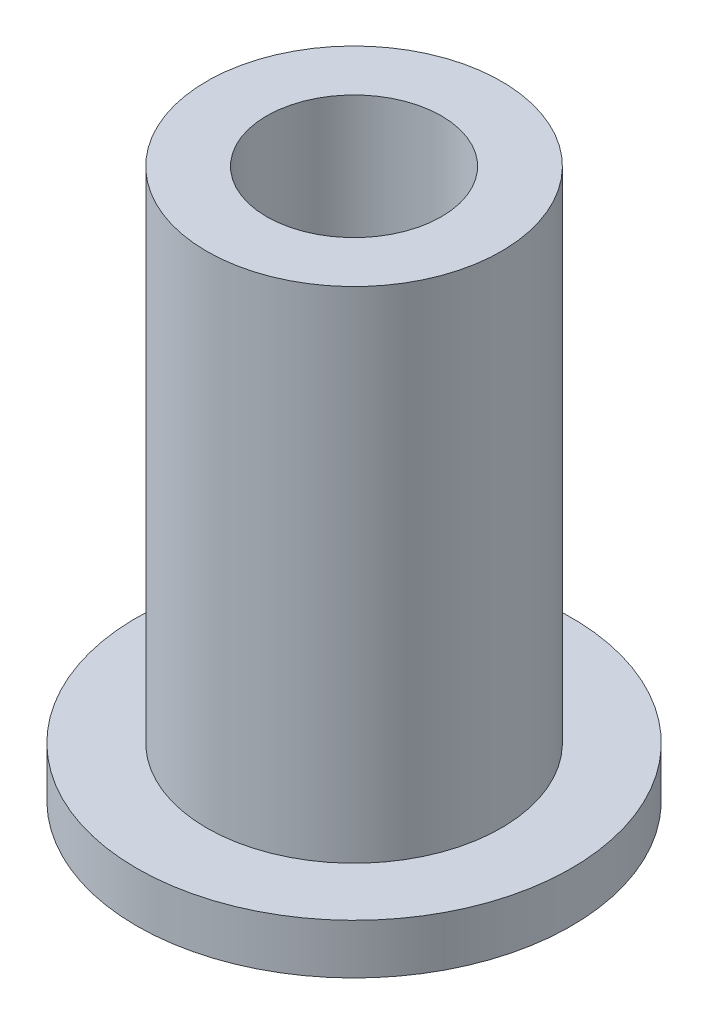
ISO-10303-21;
HEADER;
FILE_DESCRIPTION(('STEP AP214'),'2;1');
FILE_NAME('part.step','',(''),(''),'','','');
FILE_SCHEMA(('AUTOMOTIVE_DESIGN { 1 0 10303 214 1 1 1 1 }'));
ENDSEC;
DATA;
#1=APPLICATION_CONTEXT('core data for automotive mechanical design processes');
#2=APPLICATION_PROTOCOL_DEFINITION('international standard','automotive_design',2000,#1);
#3=PRODUCT_CONTEXT('',#1,'mechanical');
#4=PRODUCT('Part','Part','',(#3));
#5=PRODUCT_RELATED_PRODUCT_CATEGORY('part','',(#4));
#6=PRODUCT_DEFINITION_FORMATION('','',#4);
#7=PRODUCT_DEFINITION_CONTEXT('part definition',#1,'design');
#8=PRODUCT_DEFINITION('design','',#6,#7);
#9=PRODUCT_DEFINITION_SHAPE('','',#8);
#10=(LENGTH_UNIT() NAMED_UNIT(*) SI_UNIT(.MILLI.,.METRE.));
#11=(NAMED_UNIT(*) PLANE_ANGLE_UNIT() SI_UNIT($,.RADIAN.));
#12=(NAMED_UNIT(*) SI_UNIT($,.STERADIAN.) SOLID_ANGLE_UNIT());
#13=UNCERTAINTY_MEASURE_WITH_UNIT(LENGTH_MEASURE(1.E-05),#10,'distance_accuracy_value','');
#14=(GEOMETRIC_REPRESENTATION_CONTEXT(3) GLOBAL_UNCERTAINTY_ASSIGNED_CONTEXT((#13)) GLOBAL_UNIT_ASSIGNED_CONTEXT((#10,
#11,#12)) REPRESENTATION_CONTEXT('',''));
#15=CARTESIAN_POINT('',(0.,0.,0.));
#16=DIRECTION('',(0.,0.,1.));
#17=DIRECTION('',(1.,0.,0.));
#18=AXIS2_PLACEMENT_3D('',#15,#16,#17);
#19=CARTESIAN_POINT('',(0.,1.,0.));
#20=DIRECTION('',(0.,-1.,0.));
#21=DIRECTION('',(0.,0.,-1.));
#22=AXIS2_PLACEMENT_3D('',#19,#20,#21);
#23=CYLINDRICAL_SURFACE('',#22,4.35);
#24=CARTESIAN_POINT('',(0.,1.,0.));
#25=DIRECTION('',(0.,1.,0.));
#26=DIRECTION('',(0.,0.,1.));
#27=AXIS2_PLACEMENT_3D('',#24,#25,#26);
#28=CIRCLE('',#27,4.35);
#29=CARTESIAN_POINT('',(0.,1.,4.35));
#30=VERTEX_POINT('',#29);
#31=EDGE_CURVE('E38',#30,#30,#28,.T.);
#32=ORIENTED_EDGE('',*,*,#31,.F.);
#33=EDGE_LOOP('',(#32));
#34=FACE_BOUND('',#33,.T.);
#35=CARTESIAN_POINT('',(0.,0.,0.));
#36=DIRECTION('',(0.,1.,0.));
#37=DIRECTION('',(0.,0.,1.));
#38=AXIS2_PLACEMENT_3D('',#35,#36,#37);
#39=CIRCLE('',#38,4.35);
#40=CARTESIAN_POINT('',(0.,0.,4.35));
#41=VERTEX_POINT('',#40);
#42=EDGE_CURVE('E34',#41,#41,#39,.T.);
#43=ORIENTED_EDGE('',*,*,#42,.T.);
#44=EDGE_LOOP('',(#43));
#45=FACE_BOUND('',#44,.T.);
#46=ADVANCED_FACE('F31',(#34,#45),#23,.T.);
#47=CARTESIAN_POINT('',(0.,1.,0.));
#48=DIRECTION('',(0.,1.,0.));
#49=DIRECTION('',(0.,0.,1.));
#50=AXIS2_PLACEMENT_3D('',#47,#48,#49);
#51=PLANE('',#50);
#52=CARTESIAN_POINT('',(0.,1.,0.));
#53=DIRECTION('',(0.,1.,0.));
#54=DIRECTION('',(0.,0.,1.));
#55=AXIS2_PLACEMENT_3D('',#52,#53,#54);
#56=CIRCLE('',#55,2.95);
#57=CARTESIAN_POINT('',(0.,1.,2.95));
#58=VERTEX_POINT('',#57);
#59=EDGE_CURVE('E10',#58,#58,#56,.T.);
#60=ORIENTED_EDGE('',*,*,#59,.F.);
#61=EDGE_LOOP('',(#60));
#62=FACE_BOUND('',#61,.T.);
#63=ORIENTED_EDGE('',*,*,#31,.T.);
#64=EDGE_LOOP('',(#63));
#65=FACE_BOUND('',#64,.T.);
#66=ADVANCED_FACE('F75',(#62,#65),#51,.T.);
#67=CARTESIAN_POINT('',(0.,0.,0.));
#68=DIRECTION('',(0.,1.,0.));
#69=DIRECTION('',(0.,0.,1.));
#70=AXIS2_PLACEMENT_3D('',#67,#68,#69);
#71=PLANE('',#70);
#72=CARTESIAN_POINT('',(0.,0.,0.));
#73=DIRECTION('',(0.,1.,0.));
#74=DIRECTION('',(0.,0.,1.));
#75=AXIS2_PLACEMENT_3D('',#72,#73,#74);
#76=CIRCLE('',#75,1.75);
#77=CARTESIAN_POINT('',(0.,0.,1.75));
#78=VERTEX_POINT('',#77);
#79=EDGE_CURVE('E47',#78,#78,#76,.T.);
#80=ORIENTED_EDGE('',*,*,#79,.T.);
#81=EDGE_LOOP('',(#80));
#82=FACE_BOUND('',#81,.T.);
#83=ORIENTED_EDGE('',*,*,#42,.F.);
#84=EDGE_LOOP('',(#83));
#85=FACE_BOUND('',#84,.T.);
#86=ADVANCED_FACE('F54',(#82,#85),#71,.F.);
#87=CARTESIAN_POINT('',(0.,11.,0.));
#88=DIRECTION('',(0.,-1.,0.));
#89=DIRECTION('',(0.,0.,-1.));
#90=AXIS2_PLACEMENT_3D('',#87,#88,#89);
#91=CYLINDRICAL_SURFACE('',#90,2.95);
#92=CARTESIAN_POINT('',(0.,11.,0.));
#93=DIRECTION('',(0.,1.,0.));
#94=DIRECTION('',(0.,0.,1.));
#95=AXIS2_PLACEMENT_3D('',#92,#93,#94);
#96=CIRCLE('',#95,2.95);
#97=CARTESIAN_POINT('',(0.,11.,2.95));
#98=VERTEX_POINT('',#97);
#99=EDGE_CURVE('E44',#98,#98,#96,.T.);
#100=ORIENTED_EDGE('',*,*,#99,.F.);
#101=EDGE_LOOP('',(#100));
#102=FACE_BOUND('',#101,.T.);
#103=ORIENTED_EDGE('',*,*,#59,.T.);
#104=EDGE_LOOP('',(#103));
#105=FACE_BOUND('',#104,.T.);
#106=ADVANCED_FACE('F66',(#102,#105),#91,.T.);
#107=CARTESIAN_POINT('',(0.,11.,0.));
#108=DIRECTION('',(0.,1.,0.));
#109=DIRECTION('',(0.,0.,1.));
#110=AXIS2_PLACEMENT_3D('',#107,#108,#109);
#111=PLANE('',#110);
#112=CARTESIAN_POINT('',(0.,11.,0.));
#113=DIRECTION('',(0.,1.,0.));
#114=DIRECTION('',(0.,0.,1.));
#115=AXIS2_PLACEMENT_3D('',#112,#113,#114);
#116=CIRCLE('',#115,1.75);
#117=CARTESIAN_POINT('',(0.,11.,1.75));
#118=VERTEX_POINT('',#117);
#119=EDGE_CURVE('E48',#118,#118,#116,.T.);
#120=ORIENTED_EDGE('',*,*,#119,.F.);
#121=EDGE_LOOP('',(#120));
#122=FACE_BOUND('',#121,.T.);
#123=ORIENTED_EDGE('',*,*,#99,.T.);
#124=EDGE_LOOP('',(#123));
#125=FACE_BOUND('',#124,.T.);
#126=ADVANCED_FACE('F60',(#122,#125),#111,.T.);
#127=CARTESIAN_POINT('',(0.,0.,0.));
#128=DIRECTION('',(0.,1.,0.));
#129=DIRECTION('',(0.,0.,1.));
#130=AXIS2_PLACEMENT_3D('',#127,#128,#129);
#131=CYLINDRICAL_SURFACE('',#130,1.75);
#132=ORIENTED_EDGE('',*,*,#79,.F.);
#133=EDGE_LOOP('',(#132));
#134=FACE_BOUND('',#133,.T.);
#135=ORIENTED_EDGE('',*,*,#119,.T.);
#136=EDGE_LOOP('',(#135));
#137=FACE_BOUND('',#136,.T.);
#138=ADVANCED_FACE('F57',(#134,#137),#131,.F.);
#139=CLOSED_SHELL('',(#46,#66,#86,#106,#126,#138));
#140=MANIFOLD_SOLID_BREP('B2',#139);
#141=ADVANCED_BREP_SHAPE_REPRESENTATION('',(#18,#140),#14);
#142=SHAPE_DEFINITION_REPRESENTATION(#9,#141);
ENDSEC;
END-ISO-10303-21;
